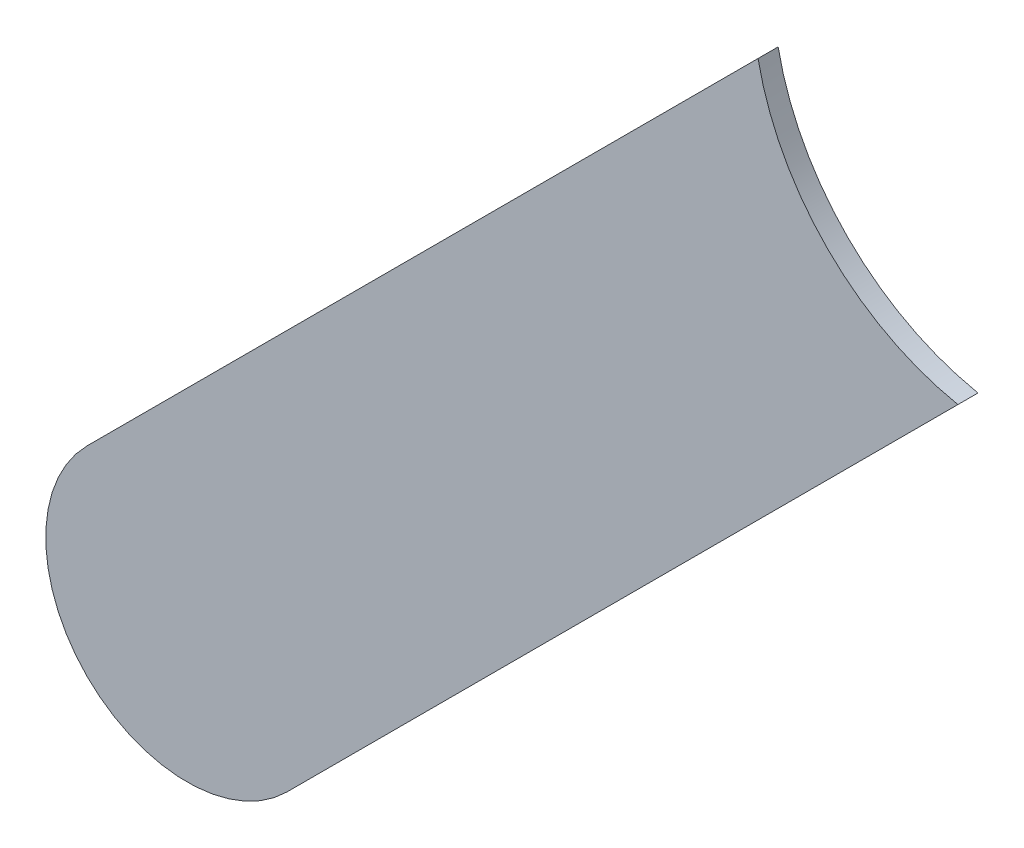
ISO-10303-21;
HEADER;
FILE_DESCRIPTION(('STEP AP214'),'2;1');
FILE_NAME('part.step','',(''),(''),'','','');
FILE_SCHEMA(('AUTOMOTIVE_DESIGN { 1 0 10303 214 1 1 1 1 }'));
ENDSEC;
DATA;
#1=APPLICATION_CONTEXT('core data for automotive mechanical design processes');
#2=APPLICATION_PROTOCOL_DEFINITION('international standard','automotive_design',2000,#1);
#3=PRODUCT_CONTEXT('',#1,'mechanical');
#4=PRODUCT('Part','Part','',(#3));
#5=PRODUCT_RELATED_PRODUCT_CATEGORY('part','',(#4));
#6=PRODUCT_DEFINITION_FORMATION('','',#4);
#7=PRODUCT_DEFINITION_CONTEXT('part definition',#1,'design');
#8=PRODUCT_DEFINITION('design','',#6,#7);
#9=PRODUCT_DEFINITION_SHAPE('','',#8);
#10=(LENGTH_UNIT() NAMED_UNIT(*) SI_UNIT(.MILLI.,.METRE.));
#11=(NAMED_UNIT(*) PLANE_ANGLE_UNIT() SI_UNIT($,.RADIAN.));
#12=(NAMED_UNIT(*) SI_UNIT($,.STERADIAN.) SOLID_ANGLE_UNIT());
#13=UNCERTAINTY_MEASURE_WITH_UNIT(LENGTH_MEASURE(1.E-05),#10,'distance_accuracy_value','');
#14=(GEOMETRIC_REPRESENTATION_CONTEXT(3) GLOBAL_UNCERTAINTY_ASSIGNED_CONTEXT((#13)) GLOBAL_UNIT_ASSIGNED_CONTEXT((#10,
#11,#12)) REPRESENTATION_CONTEXT('',''));
#15=CARTESIAN_POINT('',(0.,0.,0.));
#16=DIRECTION('',(0.,0.,1.));
#17=DIRECTION('',(1.,0.,0.));
#18=AXIS2_PLACEMENT_3D('',#15,#16,#17);
#19=CARTESIAN_POINT('',(80.08517638,115.37163362,0.));
#20=DIRECTION('',(-0.707106781186544,0.707106781186551,0.));
#21=DIRECTION('',(0.707106781186551,0.707106781186544,0.));
#22=AXIS2_PLACEMENT_3D('',#19,#20,#21);
#23=PLANE('',#22);
#24=DIRECTION('',(0.707106781186551,0.707106781186544,0.));
#25=VECTOR('',#24,1.);
#26=CARTESIAN_POINT('',(80.08517638,115.37163362,0.03556));
#27=LINE('',#26,#25);
#28=CARTESIAN_POINT('',(80.08517638,115.37163362,0.03556));
#29=VERTEX_POINT('',#28);
#30=CARTESIAN_POINT('',(81.2722118036052,116.558669043605,0.03556));
#31=VERTEX_POINT('',#30);
#32=EDGE_CURVE('E11',#29,#31,#27,.T.);
#33=ORIENTED_EDGE('',*,*,#32,.F.);
#34=DIRECTION('',(0.,0.,1.));
#35=VECTOR('',#34,1.);
#36=CARTESIAN_POINT('',(80.08517638,115.37163362,0.));
#37=LINE('',#36,#35);
#38=CARTESIAN_POINT('',(80.08517638,115.37163362,0.));
#39=VERTEX_POINT('',#38);
#40=EDGE_CURVE('E24',#39,#29,#37,.T.);
#41=ORIENTED_EDGE('',*,*,#40,.F.);
#42=DIRECTION('',(0.707106781186551,0.707106781186544,0.));
#43=VECTOR('',#42,1.);
#44=CARTESIAN_POINT('',(80.08517638,115.37163362,0.));
#45=LINE('',#44,#43);
#46=CARTESIAN_POINT('',(81.2722118036052,116.558669043605,0.));
#47=VERTEX_POINT('',#46);
#48=EDGE_CURVE('E75',#39,#47,#45,.T.);
#49=ORIENTED_EDGE('',*,*,#48,.T.);
#50=DIRECTION('',(0.,0.,1.));
#51=VECTOR('',#50,1.);
#52=CARTESIAN_POINT('',(81.2722118036052,116.558669043605,0.));
#53=LINE('',#52,#51);
#54=EDGE_CURVE('E37',#47,#31,#53,.T.);
#55=ORIENTED_EDGE('',*,*,#54,.T.);
#56=EDGE_LOOP('',(#33,#41,#49,#55));
#57=FACE_BOUND('',#56,.T.);
#58=ADVANCED_FACE('F17',(#57),#23,.F.);
#59=CARTESIAN_POINT('',(81.36001,117.00002,0.));
#60=DIRECTION('',(0.,0.,-1.));
#61=DIRECTION('',(1.,0.,0.));
#62=AXIS2_PLACEMENT_3D('',#59,#60,#61);
#63=CYLINDRICAL_SURFACE('',#62,0.4499991);
#64=DIRECTION('',(0.,0.,1.));
#65=VECTOR('',#64,1.);
#66=CARTESIAN_POINT('',(80.9186590436052,116.912221803605,0.));
#67=LINE('',#66,#65);
#68=CARTESIAN_POINT('',(80.9186590436052,116.912221803605,0.));
#69=VERTEX_POINT('',#68);
#70=CARTESIAN_POINT('',(80.9186590436052,116.912221803605,0.03556));
#71=VERTEX_POINT('',#70);
#72=EDGE_CURVE('E67',#69,#71,#67,.T.);
#73=ORIENTED_EDGE('',*,*,#72,.T.);
#74=CARTESIAN_POINT('',(81.36001,117.00002,0.03556));
#75=DIRECTION('',(0.,0.,1.));
#76=DIRECTION('',(1.,0.,0.));
#77=AXIS2_PLACEMENT_3D('',#74,#75,#76);
#78=CIRCLE('',#77,0.4499991);
#79=EDGE_CURVE('E82',#71,#31,#78,.T.);
#80=ORIENTED_EDGE('',*,*,#79,.T.);
#81=ORIENTED_EDGE('',*,*,#54,.F.);
#82=CARTESIAN_POINT('',(81.36001,117.00002,0.));
#83=DIRECTION('',(0.,0.,1.));
#84=DIRECTION('',(1.,0.,0.));
#85=AXIS2_PLACEMENT_3D('',#82,#83,#84);
#86=CIRCLE('',#85,0.4499991);
#87=EDGE_CURVE('E80',#69,#47,#86,.T.);
#88=ORIENTED_EDGE('',*,*,#87,.F.);
#89=EDGE_LOOP('',(#73,#80,#81,#88));
#90=FACE_BOUND('',#89,.T.);
#91=ADVANCED_FACE('F88',(#90),#63,.F.);
#92=CARTESIAN_POINT('',(80.9186590436052,116.912221803605,0.));
#93=DIRECTION('',(0.707106781186548,-0.707106781186548,0.));
#94=DIRECTION('',(-0.707106781186548,-0.707106781186548,0.));
#95=AXIS2_PLACEMENT_3D('',#92,#93,#94);
#96=PLANE('',#95);
#97=DIRECTION('',(-0.707106781186548,-0.707106781186548,0.));
#98=VECTOR('',#97,1.);
#99=CARTESIAN_POINT('',(81.18323362,117.17679638,0.03556));
#100=LINE('',#99,#98);
#101=CARTESIAN_POINT('',(79.73162362,115.72518638,0.03556));
#102=VERTEX_POINT('',#101);
#103=EDGE_CURVE('E71',#71,#102,#100,.T.);
#104=ORIENTED_EDGE('',*,*,#103,.F.);
#105=ORIENTED_EDGE('',*,*,#72,.F.);
#106=DIRECTION('',(-0.707106781186548,-0.707106781186548,0.));
#107=VECTOR('',#106,1.);
#108=CARTESIAN_POINT('',(81.18323362,117.17679638,0.));
#109=LINE('',#108,#107);
#110=CARTESIAN_POINT('',(79.73162362,115.72518638,0.));
#111=VERTEX_POINT('',#110);
#112=EDGE_CURVE('E63',#69,#111,#109,.T.);
#113=ORIENTED_EDGE('',*,*,#112,.T.);
#114=DIRECTION('',(0.,0.,1.));
#115=VECTOR('',#114,1.);
#116=CARTESIAN_POINT('',(79.73162362,115.72518638,0.));
#117=LINE('',#116,#115);
#118=EDGE_CURVE('E53',#111,#102,#117,.T.);
#119=ORIENTED_EDGE('',*,*,#118,.T.);
#120=EDGE_LOOP('',(#104,#105,#113,#119));
#121=FACE_BOUND('',#120,.T.);
#122=ADVANCED_FACE('F66',(#121),#96,.F.);
#123=CARTESIAN_POINT('',(79.9084,115.54841,0.));
#124=DIRECTION('',(0.,0.,-1.));
#125=DIRECTION('',(-0.707106781186548,0.707106781186548,0.));
#126=AXIS2_PLACEMENT_3D('',#123,#124,#125);
#127=CYLINDRICAL_SURFACE('',#126,0.24999955410322);
#128=CARTESIAN_POINT('',(79.9084,115.54841,0.03556));
#129=DIRECTION('',(0.,0.,1.));
#130=DIRECTION('',(-0.707106781186548,0.707106781186548,0.));
#131=AXIS2_PLACEMENT_3D('',#128,#129,#130);
#132=CIRCLE('',#131,0.24999955410322);
#133=EDGE_CURVE('E59',#102,#29,#132,.T.);
#134=ORIENTED_EDGE('',*,*,#133,.F.);
#135=ORIENTED_EDGE('',*,*,#118,.F.);
#136=CARTESIAN_POINT('',(79.9084,115.54841,0.));
#137=DIRECTION('',(0.,0.,1.));
#138=DIRECTION('',(-0.707106781186548,0.707106781186548,0.));
#139=AXIS2_PLACEMENT_3D('',#136,#137,#138);
#140=CIRCLE('',#139,0.24999955410322);
#141=EDGE_CURVE('E57',#111,#39,#140,.T.);
#142=ORIENTED_EDGE('',*,*,#141,.T.);
#143=ORIENTED_EDGE('',*,*,#40,.T.);
#144=EDGE_LOOP('',(#134,#135,#142,#143));
#145=FACE_BOUND('',#144,.T.);
#146=ADVANCED_FACE('F55',(#145),#127,.T.);
#147=CARTESIAN_POINT('',(80.08517638,115.37163362,0.));
#148=DIRECTION('',(0.,0.,-1.));
#149=DIRECTION('',(-1.,0.,0.));
#150=AXIS2_PLACEMENT_3D('',#147,#148,#149);
#151=PLANE('',#150);
#152=ORIENTED_EDGE('',*,*,#48,.F.);
#153=ORIENTED_EDGE('',*,*,#141,.F.);
#154=ORIENTED_EDGE('',*,*,#112,.F.);
#155=ORIENTED_EDGE('',*,*,#87,.T.);
#156=EDGE_LOOP('',(#152,#153,#154,#155));
#157=FACE_BOUND('',#156,.T.);
#158=ADVANCED_FACE('F74',(#157),#151,.T.);
#159=CARTESIAN_POINT('',(80.08517638,115.37163362,0.03556));
#160=DIRECTION('',(0.,0.,-1.));
#161=DIRECTION('',(-1.,0.,0.));
#162=AXIS2_PLACEMENT_3D('',#159,#160,#161);
#163=PLANE('',#162);
#164=ORIENTED_EDGE('',*,*,#133,.T.);
#165=ORIENTED_EDGE('',*,*,#32,.T.);
#166=ORIENTED_EDGE('',*,*,#79,.F.);
#167=ORIENTED_EDGE('',*,*,#103,.T.);
#168=EDGE_LOOP('',(#164,#165,#166,#167));
#169=FACE_BOUND('',#168,.T.);
#170=ADVANCED_FACE('F91',(#169),#163,.F.);
#171=CLOSED_SHELL('',(#58,#91,#122,#146,#158,#170));
#172=MANIFOLD_SOLID_BREP('B1',#171);
#173=ADVANCED_BREP_SHAPE_REPRESENTATION('',(#18,#172),#14);
#174=SHAPE_DEFINITION_REPRESENTATION(#9,#173);
ENDSEC;
END-ISO-10303-21;
